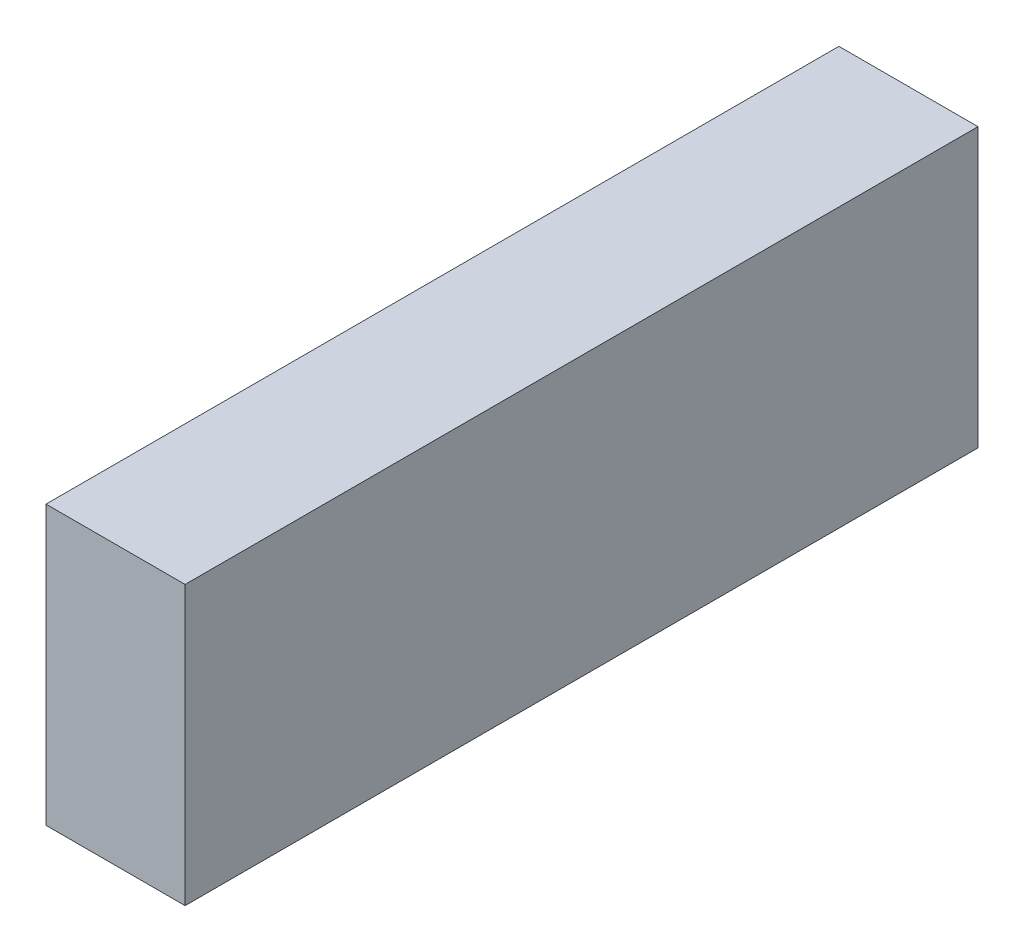
ISO-10303-21;
HEADER;
FILE_DESCRIPTION(('STEP AP214'),'2;1');
FILE_NAME('part.step','',(''),(''),'','','');
FILE_SCHEMA(('AUTOMOTIVE_DESIGN { 1 0 10303 214 1 1 1 1 }'));
ENDSEC;
DATA;
#1=APPLICATION_CONTEXT('core data for automotive mechanical design processes');
#2=APPLICATION_PROTOCOL_DEFINITION('international standard','automotive_design',2000,#1);
#3=PRODUCT_CONTEXT('',#1,'mechanical');
#4=PRODUCT('Part','Part','',(#3));
#5=PRODUCT_RELATED_PRODUCT_CATEGORY('part','',(#4));
#6=PRODUCT_DEFINITION_FORMATION('','',#4);
#7=PRODUCT_DEFINITION_CONTEXT('part definition',#1,'design');
#8=PRODUCT_DEFINITION('design','',#6,#7);
#9=PRODUCT_DEFINITION_SHAPE('','',#8);
#10=(LENGTH_UNIT() NAMED_UNIT(*) SI_UNIT(.MILLI.,.METRE.));
#11=(NAMED_UNIT(*) PLANE_ANGLE_UNIT() SI_UNIT($,.RADIAN.));
#12=(NAMED_UNIT(*) SI_UNIT($,.STERADIAN.) SOLID_ANGLE_UNIT());
#13=UNCERTAINTY_MEASURE_WITH_UNIT(LENGTH_MEASURE(1.E-05),#10,'distance_accuracy_value','');
#14=(GEOMETRIC_REPRESENTATION_CONTEXT(3) GLOBAL_UNCERTAINTY_ASSIGNED_CONTEXT((#13)) GLOBAL_UNIT_ASSIGNED_CONTEXT((#10,
#11,#12)) REPRESENTATION_CONTEXT('',''));
#15=CARTESIAN_POINT('',(0.,0.,0.));
#16=DIRECTION('',(0.,0.,1.));
#17=DIRECTION('',(1.,0.,0.));
#18=AXIS2_PLACEMENT_3D('',#15,#16,#17);
#19=CARTESIAN_POINT('',(10.,0.,0.));
#20=DIRECTION('',(0.,0.,-1.));
#21=DIRECTION('',(-1.,0.,0.));
#22=AXIS2_PLACEMENT_3D('',#19,#20,#21);
#23=PLANE('',#22);
#24=DIRECTION('',(0.,-1.,0.));
#25=VECTOR('',#24,1.);
#26=CARTESIAN_POINT('',(0.,0.,0.));
#27=LINE('',#26,#25);
#28=CARTESIAN_POINT('',(0.,20.,0.));
#29=VERTEX_POINT('',#28);
#30=CARTESIAN_POINT('',(0.,0.,0.));
#31=VERTEX_POINT('',#30);
#32=EDGE_CURVE('E105',#29,#31,#27,.T.);
#33=ORIENTED_EDGE('',*,*,#32,.T.);
#34=DIRECTION('',(-1.,0.,0.));
#35=VECTOR('',#34,1.);
#36=CARTESIAN_POINT('',(10.,0.,0.));
#37=LINE('',#36,#35);
#38=CARTESIAN_POINT('',(10.,0.,0.));
#39=VERTEX_POINT('',#38);
#40=EDGE_CURVE('E11',#39,#31,#37,.T.);
#41=ORIENTED_EDGE('',*,*,#40,.F.);
#42=DIRECTION('',(0.,-1.,0.));
#43=VECTOR('',#42,1.);
#44=CARTESIAN_POINT('',(10.,0.,0.));
#45=LINE('',#44,#43);
#46=CARTESIAN_POINT('',(10.,20.,0.));
#47=VERTEX_POINT('',#46);
#48=EDGE_CURVE('E89',#47,#39,#45,.T.);
#49=ORIENTED_EDGE('',*,*,#48,.F.);
#50=DIRECTION('',(-1.,0.,0.));
#51=VECTOR('',#50,1.);
#52=CARTESIAN_POINT('',(10.,20.,0.));
#53=LINE('',#52,#51);
#54=EDGE_CURVE('E97',#47,#29,#53,.T.);
#55=ORIENTED_EDGE('',*,*,#54,.T.);
#56=EDGE_LOOP('',(#33,#41,#49,#55));
#57=FACE_BOUND('',#56,.T.);
#58=ADVANCED_FACE('F39',(#57),#23,.F.);
#59=CARTESIAN_POINT('',(10.,0.,0.));
#60=DIRECTION('',(0.,1.,0.));
#61=DIRECTION('',(0.,0.,1.));
#62=AXIS2_PLACEMENT_3D('',#59,#60,#61);
#63=PLANE('',#62);
#64=DIRECTION('',(0.,0.,-1.));
#65=VECTOR('',#64,1.);
#66=CARTESIAN_POINT('',(0.,0.,0.));
#67=LINE('',#66,#65);
#68=CARTESIAN_POINT('',(0.,0.,-57.));
#69=VERTEX_POINT('',#68);
#70=EDGE_CURVE('E92',#31,#69,#67,.T.);
#71=ORIENTED_EDGE('',*,*,#70,.T.);
#72=DIRECTION('',(-1.,0.,0.));
#73=VECTOR('',#72,1.);
#74=CARTESIAN_POINT('',(10.,0.,-57.));
#75=LINE('',#74,#73);
#76=CARTESIAN_POINT('',(10.,0.,-57.));
#77=VERTEX_POINT('',#76);
#78=EDGE_CURVE('E50',#77,#69,#75,.T.);
#79=ORIENTED_EDGE('',*,*,#78,.F.);
#80=DIRECTION('',(0.,0.,-1.));
#81=VECTOR('',#80,1.);
#82=CARTESIAN_POINT('',(10.,0.,0.));
#83=LINE('',#82,#81);
#84=EDGE_CURVE('E82',#39,#77,#83,.T.);
#85=ORIENTED_EDGE('',*,*,#84,.F.);
#86=ORIENTED_EDGE('',*,*,#40,.T.);
#87=EDGE_LOOP('',(#71,#79,#85,#86));
#88=FACE_BOUND('',#87,.T.);
#89=ADVANCED_FACE('F93',(#88),#63,.F.);
#90=CARTESIAN_POINT('',(10.,0.,-57.));
#91=DIRECTION('',(0.,0.,1.));
#92=DIRECTION('',(1.,0.,0.));
#93=AXIS2_PLACEMENT_3D('',#90,#91,#92);
#94=PLANE('',#93);
#95=DIRECTION('',(0.,1.,0.));
#96=VECTOR('',#95,1.);
#97=CARTESIAN_POINT('',(0.,0.,-57.));
#98=LINE('',#97,#96);
#99=CARTESIAN_POINT('',(0.,20.,-57.));
#100=VERTEX_POINT('',#99);
#101=EDGE_CURVE('E72',#69,#100,#98,.T.);
#102=ORIENTED_EDGE('',*,*,#101,.T.);
#103=DIRECTION('',(-1.,0.,0.));
#104=VECTOR('',#103,1.);
#105=CARTESIAN_POINT('',(10.,20.,-57.));
#106=LINE('',#105,#104);
#107=CARTESIAN_POINT('',(10.,20.,-57.));
#108=VERTEX_POINT('',#107);
#109=EDGE_CURVE('E94',#108,#100,#106,.T.);
#110=ORIENTED_EDGE('',*,*,#109,.F.);
#111=DIRECTION('',(0.,1.,0.));
#112=VECTOR('',#111,1.);
#113=CARTESIAN_POINT('',(10.,0.,-57.));
#114=LINE('',#113,#112);
#115=EDGE_CURVE('E88',#77,#108,#114,.T.);
#116=ORIENTED_EDGE('',*,*,#115,.F.);
#117=ORIENTED_EDGE('',*,*,#78,.T.);
#118=EDGE_LOOP('',(#102,#110,#116,#117));
#119=FACE_BOUND('',#118,.T.);
#120=ADVANCED_FACE('F96',(#119),#94,.F.);
#121=CARTESIAN_POINT('',(10.,20.,0.));
#122=DIRECTION('',(0.,-1.,0.));
#123=DIRECTION('',(0.,0.,-1.));
#124=AXIS2_PLACEMENT_3D('',#121,#122,#123);
#125=PLANE('',#124);
#126=DIRECTION('',(0.,0.,1.));
#127=VECTOR('',#126,1.);
#128=CARTESIAN_POINT('',(0.,20.,0.));
#129=LINE('',#128,#127);
#130=EDGE_CURVE('E76',#100,#29,#129,.T.);
#131=ORIENTED_EDGE('',*,*,#130,.T.);
#132=ORIENTED_EDGE('',*,*,#54,.F.);
#133=DIRECTION('',(0.,0.,1.));
#134=VECTOR('',#133,1.);
#135=CARTESIAN_POINT('',(10.,20.,0.));
#136=LINE('',#135,#134);
#137=EDGE_CURVE('E54',#108,#47,#136,.T.);
#138=ORIENTED_EDGE('',*,*,#137,.F.);
#139=ORIENTED_EDGE('',*,*,#109,.T.);
#140=EDGE_LOOP('',(#131,#132,#138,#139));
#141=FACE_BOUND('',#140,.T.);
#142=ADVANCED_FACE('F108',(#141),#125,.F.);
#143=CARTESIAN_POINT('',(10.,0.,0.));
#144=DIRECTION('',(-1.,0.,0.));
#145=DIRECTION('',(0.,0.,1.));
#146=AXIS2_PLACEMENT_3D('',#143,#144,#145);
#147=PLANE('',#146);
#148=ORIENTED_EDGE('',*,*,#48,.T.);
#149=ORIENTED_EDGE('',*,*,#84,.T.);
#150=ORIENTED_EDGE('',*,*,#115,.T.);
#151=ORIENTED_EDGE('',*,*,#137,.T.);
#152=EDGE_LOOP('',(#148,#149,#150,#151));
#153=FACE_BOUND('',#152,.T.);
#154=ADVANCED_FACE('F86',(#153),#147,.F.);
#155=CARTESIAN_POINT('',(0.,0.,0.));
#156=DIRECTION('',(-1.,0.,0.));
#157=DIRECTION('',(0.,0.,1.));
#158=AXIS2_PLACEMENT_3D('',#155,#156,#157);
#159=PLANE('',#158);
#160=ORIENTED_EDGE('',*,*,#32,.F.);
#161=ORIENTED_EDGE('',*,*,#130,.F.);
#162=ORIENTED_EDGE('',*,*,#101,.F.);
#163=ORIENTED_EDGE('',*,*,#70,.F.);
#164=EDGE_LOOP('',(#160,#161,#162,#163));
#165=FACE_BOUND('',#164,.T.);
#166=ADVANCED_FACE('F115',(#165),#159,.T.);
#167=CLOSED_SHELL('',(#58,#89,#120,#142,#154,#166));
#168=MANIFOLD_SOLID_BREP('B2',#167);
#169=ADVANCED_BREP_SHAPE_REPRESENTATION('',(#18,#168),#14);
#170=SHAPE_DEFINITION_REPRESENTATION(#9,#169);
ENDSEC;
END-ISO-10303-21;
